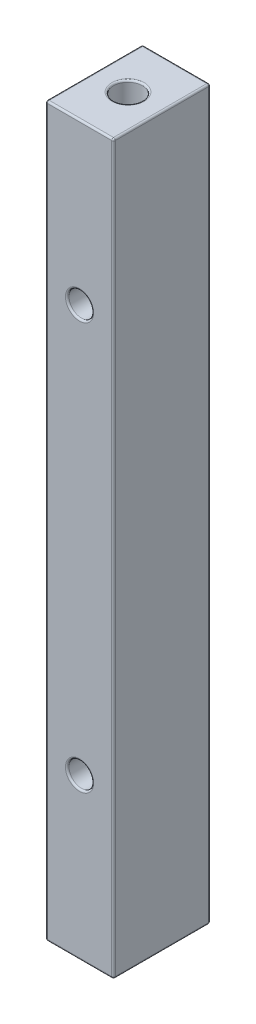
ISO-10303-21;
HEADER;
FILE_DESCRIPTION(('STEP AP214'),'2;1');
FILE_NAME('part.step','',(''),(''),'','','');
FILE_SCHEMA(('AUTOMOTIVE_DESIGN { 1 0 10303 214 1 1 1 1 }'));
ENDSEC;
DATA;
#1=APPLICATION_CONTEXT('core data for automotive mechanical design processes');
#2=APPLICATION_PROTOCOL_DEFINITION('international standard','automotive_design',2000,#1);
#3=PRODUCT_CONTEXT('',#1,'mechanical');
#4=PRODUCT('Part','Part','',(#3));
#5=PRODUCT_RELATED_PRODUCT_CATEGORY('part','',(#4));
#6=PRODUCT_DEFINITION_FORMATION('','',#4);
#7=PRODUCT_DEFINITION_CONTEXT('part definition',#1,'design');
#8=PRODUCT_DEFINITION('design','',#6,#7);
#9=PRODUCT_DEFINITION_SHAPE('','',#8);
#10=(LENGTH_UNIT() NAMED_UNIT(*) SI_UNIT(.MILLI.,.METRE.));
#11=(NAMED_UNIT(*) PLANE_ANGLE_UNIT() SI_UNIT($,.RADIAN.));
#12=(NAMED_UNIT(*) SI_UNIT($,.STERADIAN.) SOLID_ANGLE_UNIT());
#13=UNCERTAINTY_MEASURE_WITH_UNIT(LENGTH_MEASURE(1.E-05),#10,'distance_accuracy_value','');
#14=(GEOMETRIC_REPRESENTATION_CONTEXT(3) GLOBAL_UNCERTAINTY_ASSIGNED_CONTEXT((#13)) GLOBAL_UNIT_ASSIGNED_CONTEXT((#10,
#11,#12)) REPRESENTATION_CONTEXT('',''));
#15=CARTESIAN_POINT('',(0.,0.,0.));
#16=DIRECTION('',(0.,0.,1.));
#17=DIRECTION('',(1.,0.,0.));
#18=AXIS2_PLACEMENT_3D('',#15,#16,#17);
#19=CARTESIAN_POINT('',(0.,51.054,0.));
#20=DIRECTION('',(0.,-1.,0.));
#21=DIRECTION('',(0.,0.,-1.));
#22=AXIS2_PLACEMENT_3D('',#19,#20,#21);
#23=CYLINDRICAL_SURFACE('',#22,2.0193);
#24=CARTESIAN_POINT('',(0.,-50.8,0.));
#25=DIRECTION('',(0.,1.,0.));
#26=DIRECTION('',(0.,0.,1.));
#27=AXIS2_PLACEMENT_3D('',#24,#25,#26);
#28=CIRCLE('',#27,2.0193);
#29=CARTESIAN_POINT('',(0.,-50.8,2.0193));
#30=VERTEX_POINT('',#29);
#31=EDGE_CURVE('E43',#30,#30,#28,.F.);
#32=ORIENTED_EDGE('',*,*,#31,.T.);
#33=EDGE_LOOP('',(#32));
#34=FACE_BOUND('',#33,.T.);
#35=CARTESIAN_POINT('',(0.,-38.354,0.));
#36=DIRECTION('',(0.,1.,0.));
#37=DIRECTION('',(0.,0.,1.));
#38=AXIS2_PLACEMENT_3D('',#35,#36,#37);
#39=CIRCLE('',#38,2.0193);
#40=CARTESIAN_POINT('',(0.,-38.354,2.0193));
#41=VERTEX_POINT('',#40);
#42=EDGE_CURVE('E293',#41,#41,#39,.F.);
#43=ORIENTED_EDGE('',*,*,#42,.F.);
#44=EDGE_LOOP('',(#43));
#45=FACE_BOUND('',#44,.T.);
#46=ADVANCED_FACE('F34',(#34,#45),#23,.F.);
#47=CARTESIAN_POINT('',(0.,51.054,0.));
#48=DIRECTION('',(0.,1.,0.));
#49=DIRECTION('',(0.,0.,1.));
#50=AXIS2_PLACEMENT_3D('',#47,#48,#49);
#51=PLANE('',#50);
#52=DIRECTION('',(0.,0.,1.));
#53=VECTOR('',#52,1.);
#54=CARTESIAN_POINT('',(-4.5085,51.054,6.79958));
#55=LINE('',#54,#53);
#56=CARTESIAN_POINT('',(-4.5085,51.054,-6.54558));
#57=VERTEX_POINT('',#56);
#58=CARTESIAN_POINT('',(-4.5085,51.054,6.54558));
#59=VERTEX_POINT('',#58);
#60=EDGE_CURVE('E136',#57,#59,#55,.T.);
#61=ORIENTED_EDGE('',*,*,#60,.T.);
#62=DIRECTION('',(1.,0.,0.));
#63=VECTOR('',#62,1.);
#64=CARTESIAN_POINT('',(4.7625,51.054,6.54558));
#65=LINE('',#64,#63);
#66=CARTESIAN_POINT('',(4.5085,51.054,6.54558));
#67=VERTEX_POINT('',#66);
#68=EDGE_CURVE('E132',#59,#67,#65,.T.);
#69=ORIENTED_EDGE('',*,*,#68,.T.);
#70=DIRECTION('',(0.,0.,-1.));
#71=VECTOR('',#70,1.);
#72=CARTESIAN_POINT('',(4.5085,51.054,-6.79958));
#73=LINE('',#72,#71);
#74=CARTESIAN_POINT('',(4.5085,51.054,-6.54558));
#75=VERTEX_POINT('',#74);
#76=EDGE_CURVE('E123',#67,#75,#73,.T.);
#77=ORIENTED_EDGE('',*,*,#76,.T.);
#78=DIRECTION('',(-1.,0.,0.));
#79=VECTOR('',#78,1.);
#80=CARTESIAN_POINT('',(-4.7625,51.054,-6.54558));
#81=LINE('',#80,#79);
#82=EDGE_CURVE('E129',#75,#57,#81,.T.);
#83=ORIENTED_EDGE('',*,*,#82,.T.);
#84=EDGE_LOOP('',(#61,#69,#77,#83));
#85=FACE_BOUND('',#84,.T.);
#86=CARTESIAN_POINT('',(0.,51.054,0.));
#87=DIRECTION('',(0.,1.,0.));
#88=DIRECTION('',(0.,0.,1.));
#89=AXIS2_PLACEMENT_3D('',#86,#87,#88);
#90=CIRCLE('',#89,2.2733);
#91=CARTESIAN_POINT('',(0.,51.054,2.2733));
#92=VERTEX_POINT('',#91);
#93=EDGE_CURVE('E162',#92,#92,#90,.F.);
#94=ORIENTED_EDGE('',*,*,#93,.T.);
#95=EDGE_LOOP('',(#94));
#96=FACE_BOUND('',#95,.T.);
#97=ADVANCED_FACE('F126',(#85,#96),#51,.T.);
#98=CARTESIAN_POINT('',(0.,-51.054,0.));
#99=DIRECTION('',(0.,1.,0.));
#100=DIRECTION('',(0.,0.,1.));
#101=AXIS2_PLACEMENT_3D('',#98,#99,#100);
#102=PLANE('',#101);
#103=DIRECTION('',(0.,0.,-1.));
#104=VECTOR('',#103,1.);
#105=CARTESIAN_POINT('',(4.5085,-51.054,0.));
#106=LINE('',#105,#104);
#107=CARTESIAN_POINT('',(4.5085,-51.054,-6.54558));
#108=VERTEX_POINT('',#107);
#109=CARTESIAN_POINT('',(4.5085,-51.054,6.54558));
#110=VERTEX_POINT('',#109);
#111=EDGE_CURVE('E185',#108,#110,#106,.F.);
#112=ORIENTED_EDGE('',*,*,#111,.T.);
#113=DIRECTION('',(1.,0.,0.));
#114=VECTOR('',#113,1.);
#115=CARTESIAN_POINT('',(0.,-51.054,6.54558));
#116=LINE('',#115,#114);
#117=CARTESIAN_POINT('',(-4.5085,-51.054,6.54558));
#118=VERTEX_POINT('',#117);
#119=EDGE_CURVE('E190',#110,#118,#116,.F.);
#120=ORIENTED_EDGE('',*,*,#119,.T.);
#121=DIRECTION('',(0.,0.,1.));
#122=VECTOR('',#121,1.);
#123=CARTESIAN_POINT('',(-4.5085,-51.054,0.));
#124=LINE('',#123,#122);
#125=CARTESIAN_POINT('',(-4.5085,-51.054,-6.54558));
#126=VERTEX_POINT('',#125);
#127=EDGE_CURVE('E187',#118,#126,#124,.F.);
#128=ORIENTED_EDGE('',*,*,#127,.T.);
#129=DIRECTION('',(-1.,0.,0.));
#130=VECTOR('',#129,1.);
#131=CARTESIAN_POINT('',(0.,-51.054,-6.54558));
#132=LINE('',#131,#130);
#133=EDGE_CURVE('E183',#126,#108,#132,.F.);
#134=ORIENTED_EDGE('',*,*,#133,.T.);
#135=EDGE_LOOP('',(#112,#120,#128,#134));
#136=FACE_BOUND('',#135,.T.);
#137=CARTESIAN_POINT('',(0.,-51.054,0.));
#138=DIRECTION('',(0.,1.,0.));
#139=DIRECTION('',(0.,0.,1.));
#140=AXIS2_PLACEMENT_3D('',#137,#138,#139);
#141=CIRCLE('',#140,2.2733);
#142=CARTESIAN_POINT('',(0.,-51.054,2.2733));
#143=VERTEX_POINT('',#142);
#144=EDGE_CURVE('E180',#143,#143,#141,.T.);
#145=ORIENTED_EDGE('',*,*,#144,.T.);
#146=EDGE_LOOP('',(#145));
#147=FACE_BOUND('',#146,.T.);
#148=ADVANCED_FACE('F328',(#136,#147),#102,.F.);
#149=CARTESIAN_POINT('',(4.7625,51.054,6.79958));
#150=DIRECTION('',(-1.,0.,0.));
#151=DIRECTION('',(0.,0.,1.));
#152=AXIS2_PLACEMENT_3D('',#149,#150,#151);
#153=PLANE('',#152);
#154=DIRECTION('',(0.,0.,-1.));
#155=VECTOR('',#154,1.);
#156=CARTESIAN_POINT('',(4.7625,50.8,6.79958));
#157=LINE('',#156,#155);
#158=CARTESIAN_POINT('',(4.7625,50.8,-6.54558));
#159=VERTEX_POINT('',#158);
#160=CARTESIAN_POINT('',(4.7625,50.8,6.54558));
#161=VERTEX_POINT('',#160);
#162=EDGE_CURVE('E144',#159,#161,#157,.F.);
#163=ORIENTED_EDGE('',*,*,#162,.T.);
#164=DIRECTION('',(0.,-1.,0.));
#165=VECTOR('',#164,1.);
#166=CARTESIAN_POINT('',(4.7625,51.054,6.54558));
#167=LINE('',#166,#165);
#168=CARTESIAN_POINT('',(4.7625,-50.8,6.54558));
#169=VERTEX_POINT('',#168);
#170=EDGE_CURVE('E197',#161,#169,#167,.T.);
#171=ORIENTED_EDGE('',*,*,#170,.T.);
#172=DIRECTION('',(0.,0.,-1.));
#173=VECTOR('',#172,1.);
#174=CARTESIAN_POINT('',(4.7625,-50.8,6.79958));
#175=LINE('',#174,#173);
#176=CARTESIAN_POINT('',(4.7625,-50.8,-6.54558));
#177=VERTEX_POINT('',#176);
#178=EDGE_CURVE('E194',#169,#177,#175,.T.);
#179=ORIENTED_EDGE('',*,*,#178,.T.);
#180=DIRECTION('',(0.,-1.,0.));
#181=VECTOR('',#180,1.);
#182=CARTESIAN_POINT('',(4.7625,51.054,-6.54558));
#183=LINE('',#182,#181);
#184=EDGE_CURVE('E192',#177,#159,#183,.F.);
#185=ORIENTED_EDGE('',*,*,#184,.T.);
#186=EDGE_LOOP('',(#163,#171,#179,#185));
#187=FACE_BOUND('',#186,.T.);
#188=ADVANCED_FACE('F339',(#187),#153,.F.);
#189=CARTESIAN_POINT('',(4.7625,51.054,-6.79958));
#190=DIRECTION('',(0.,0.,1.));
#191=DIRECTION('',(1.,0.,0.));
#192=AXIS2_PLACEMENT_3D('',#189,#190,#191);
#193=PLANE('',#192);
#194=DIRECTION('',(-1.,0.,0.));
#195=VECTOR('',#194,1.);
#196=CARTESIAN_POINT('',(4.7625,50.8,-6.79958));
#197=LINE('',#196,#195);
#198=CARTESIAN_POINT('',(-4.5085,50.8,-6.79958));
#199=VERTEX_POINT('',#198);
#200=CARTESIAN_POINT('',(4.5085,50.8,-6.79958));
#201=VERTEX_POINT('',#200);
#202=EDGE_CURVE('E51',#199,#201,#197,.F.);
#203=ORIENTED_EDGE('',*,*,#202,.T.);
#204=DIRECTION('',(0.,-1.,0.));
#205=VECTOR('',#204,1.);
#206=CARTESIAN_POINT('',(4.5085,51.054,-6.79958));
#207=LINE('',#206,#205);
#208=CARTESIAN_POINT('',(4.5085,-50.8,-6.79958));
#209=VERTEX_POINT('',#208);
#210=EDGE_CURVE('E236',#201,#209,#207,.T.);
#211=ORIENTED_EDGE('',*,*,#210,.T.);
#212=DIRECTION('',(-1.,0.,0.));
#213=VECTOR('',#212,1.);
#214=CARTESIAN_POINT('',(4.7625,-50.8,-6.79958));
#215=LINE('',#214,#213);
#216=CARTESIAN_POINT('',(-4.5085,-50.8,-6.79958));
#217=VERTEX_POINT('',#216);
#218=EDGE_CURVE('E232',#209,#217,#215,.T.);
#219=ORIENTED_EDGE('',*,*,#218,.T.);
#220=DIRECTION('',(0.,-1.,0.));
#221=VECTOR('',#220,1.);
#222=CARTESIAN_POINT('',(-4.5085,51.054,-6.79958));
#223=LINE('',#222,#221);
#224=EDGE_CURVE('E56',#217,#199,#223,.F.);
#225=ORIENTED_EDGE('',*,*,#224,.T.);
#226=EDGE_LOOP('',(#203,#211,#219,#225));
#227=FACE_BOUND('',#226,.T.);
#228=CARTESIAN_POINT('',(0.,-28.575,-6.79958));
#229=DIRECTION('',(0.,0.,1.));
#230=DIRECTION('',(1.,0.,0.));
#231=AXIS2_PLACEMENT_3D('',#228,#229,#230);
#232=CIRCLE('',#231,1.9812);
#233=CARTESIAN_POINT('',(1.9812,-28.575,-6.79958));
#234=VERTEX_POINT('',#233);
#235=EDGE_CURVE('E229',#234,#234,#232,.T.);
#236=ORIENTED_EDGE('',*,*,#235,.T.);
#237=EDGE_LOOP('',(#236));
#238=FACE_BOUND('',#237,.T.);
#239=CARTESIAN_POINT('',(0.,28.575,-6.79958));
#240=DIRECTION('',(0.,0.,1.));
#241=DIRECTION('',(1.,0.,0.));
#242=AXIS2_PLACEMENT_3D('',#239,#240,#241);
#243=CIRCLE('',#242,1.9812);
#244=CARTESIAN_POINT('',(1.98120000000001,28.575,-6.79958));
#245=VERTEX_POINT('',#244);
#246=EDGE_CURVE('E226',#245,#245,#243,.T.);
#247=ORIENTED_EDGE('',*,*,#246,.T.);
#248=EDGE_LOOP('',(#247));
#249=FACE_BOUND('',#248,.T.);
#250=ADVANCED_FACE('F345',(#227,#238,#249),#193,.F.);
#251=CARTESIAN_POINT('',(-4.7625,51.054,6.79958));
#252=DIRECTION('',(1.,0.,0.));
#253=DIRECTION('',(0.,0.,-1.));
#254=AXIS2_PLACEMENT_3D('',#251,#252,#253);
#255=PLANE('',#254);
#256=DIRECTION('',(0.,0.,1.));
#257=VECTOR('',#256,1.);
#258=CARTESIAN_POINT('',(-4.7625,-50.8,6.79958));
#259=LINE('',#258,#257);
#260=CARTESIAN_POINT('',(-4.7625,-50.8,-6.54558));
#261=VERTEX_POINT('',#260);
#262=CARTESIAN_POINT('',(-4.7625,-50.8,6.54558));
#263=VERTEX_POINT('',#262);
#264=EDGE_CURVE('E173',#261,#263,#259,.T.);
#265=ORIENTED_EDGE('',*,*,#264,.T.);
#266=DIRECTION('',(0.,-1.,0.));
#267=VECTOR('',#266,1.);
#268=CARTESIAN_POINT('',(-4.7625,51.054,6.54558));
#269=LINE('',#268,#267);
#270=CARTESIAN_POINT('',(-4.7625,50.8,6.54558));
#271=VERTEX_POINT('',#270);
#272=EDGE_CURVE('E178',#263,#271,#269,.F.);
#273=ORIENTED_EDGE('',*,*,#272,.T.);
#274=DIRECTION('',(0.,0.,1.));
#275=VECTOR('',#274,1.);
#276=CARTESIAN_POINT('',(-4.7625,50.8,-6.79958));
#277=LINE('',#276,#275);
#278=CARTESIAN_POINT('',(-4.7625,50.8,-6.54558));
#279=VERTEX_POINT('',#278);
#280=EDGE_CURVE('E175',#271,#279,#277,.F.);
#281=ORIENTED_EDGE('',*,*,#280,.T.);
#282=DIRECTION('',(0.,-1.,0.));
#283=VECTOR('',#282,1.);
#284=CARTESIAN_POINT('',(-4.7625,51.054,-6.54558));
#285=LINE('',#284,#283);
#286=EDGE_CURVE('E171',#279,#261,#285,.T.);
#287=ORIENTED_EDGE('',*,*,#286,.T.);
#288=EDGE_LOOP('',(#265,#273,#281,#287));
#289=FACE_BOUND('',#288,.T.);
#290=ADVANCED_FACE('F318',(#289),#255,.F.);
#291=CARTESIAN_POINT('',(4.7625,51.054,6.79958));
#292=DIRECTION('',(0.,0.,-1.));
#293=DIRECTION('',(-1.,0.,0.));
#294=AXIS2_PLACEMENT_3D('',#291,#292,#293);
#295=PLANE('',#294);
#296=DIRECTION('',(1.,0.,0.));
#297=VECTOR('',#296,1.);
#298=CARTESIAN_POINT('',(-4.7625,50.8,6.79958));
#299=LINE('',#298,#297);
#300=CARTESIAN_POINT('',(4.5085,50.8,6.79958));
#301=VERTEX_POINT('',#300);
#302=CARTESIAN_POINT('',(-4.5085,50.8,6.79958));
#303=VERTEX_POINT('',#302);
#304=EDGE_CURVE('E209',#301,#303,#299,.F.);
#305=ORIENTED_EDGE('',*,*,#304,.T.);
#306=DIRECTION('',(0.,-1.,0.));
#307=VECTOR('',#306,1.);
#308=CARTESIAN_POINT('',(-4.5085,51.054,6.79958));
#309=LINE('',#308,#307);
#310=CARTESIAN_POINT('',(-4.5085,-50.8,6.79958));
#311=VERTEX_POINT('',#310);
#312=EDGE_CURVE('E211',#303,#311,#309,.T.);
#313=ORIENTED_EDGE('',*,*,#312,.T.);
#314=DIRECTION('',(1.,0.,0.));
#315=VECTOR('',#314,1.);
#316=CARTESIAN_POINT('',(4.7625,-50.8,6.79958));
#317=LINE('',#316,#315);
#318=CARTESIAN_POINT('',(4.5085,-50.8,6.79958));
#319=VERTEX_POINT('',#318);
#320=EDGE_CURVE('E205',#311,#319,#317,.T.);
#321=ORIENTED_EDGE('',*,*,#320,.T.);
#322=DIRECTION('',(0.,-1.,0.));
#323=VECTOR('',#322,1.);
#324=CARTESIAN_POINT('',(4.5085,51.054,6.79958));
#325=LINE('',#324,#323);
#326=EDGE_CURVE('E207',#319,#301,#325,.F.);
#327=ORIENTED_EDGE('',*,*,#326,.T.);
#328=EDGE_LOOP('',(#305,#313,#321,#327));
#329=FACE_BOUND('',#328,.T.);
#330=CARTESIAN_POINT('',(0.,-28.575,6.79958));
#331=DIRECTION('',(0.,0.,-1.));
#332=DIRECTION('',(-1.,0.,0.));
#333=AXIS2_PLACEMENT_3D('',#330,#331,#332);
#334=CIRCLE('',#333,1.9812);
#335=CARTESIAN_POINT('',(-1.9812,-28.575,6.79958));
#336=VERTEX_POINT('',#335);
#337=EDGE_CURVE('E202',#336,#336,#334,.T.);
#338=ORIENTED_EDGE('',*,*,#337,.T.);
#339=EDGE_LOOP('',(#338));
#340=FACE_BOUND('',#339,.T.);
#341=CARTESIAN_POINT('',(0.,28.575,6.79958));
#342=DIRECTION('',(0.,0.,-1.));
#343=DIRECTION('',(-1.,0.,0.));
#344=AXIS2_PLACEMENT_3D('',#341,#342,#343);
#345=CIRCLE('',#344,1.9812);
#346=CARTESIAN_POINT('',(-1.98119999999999,28.575,6.79958));
#347=VERTEX_POINT('',#346);
#348=EDGE_CURVE('E199',#347,#347,#345,.T.);
#349=ORIENTED_EDGE('',*,*,#348,.T.);
#350=EDGE_LOOP('',(#349));
#351=FACE_BOUND('',#350,.T.);
#352=ADVANCED_FACE('F310',(#329,#340,#351),#295,.F.);
#353=CARTESIAN_POINT('',(0.,50.8,0.));
#354=DIRECTION('',(0.,1.,0.));
#355=DIRECTION('',(0.,0.,1.));
#356=AXIS2_PLACEMENT_3D('',#353,#354,#355);
#357=CIRCLE('',#356,2.0193);
#358=CARTESIAN_POINT('',(0.,50.8,2.0193));
#359=VERTEX_POINT('',#358);
#360=EDGE_CURVE('E12',#359,#359,#357,.T.);
#361=ORIENTED_EDGE('',*,*,#360,.T.);
#362=EDGE_LOOP('',(#361));
#363=FACE_BOUND('',#362,.T.);
#364=CARTESIAN_POINT('',(0.,38.354,0.));
#365=DIRECTION('',(0.,1.,0.));
#366=DIRECTION('',(0.,0.,1.));
#367=AXIS2_PLACEMENT_3D('',#364,#365,#366);
#368=CIRCLE('',#367,2.0193);
#369=CARTESIAN_POINT('',(0.,38.354,2.0193));
#370=VERTEX_POINT('',#369);
#371=EDGE_CURVE('E165',#370,#370,#368,.T.);
#372=ORIENTED_EDGE('',*,*,#371,.F.);
#373=EDGE_LOOP('',(#372));
#374=FACE_BOUND('',#373,.T.);
#375=ADVANCED_FACE('F307',(#363,#374),#23,.F.);
#376=CARTESIAN_POINT('',(0.,-38.354,0.));
#377=DIRECTION('',(0.,1.,0.));
#378=DIRECTION('',(0.,0.,1.));
#379=AXIS2_PLACEMENT_3D('',#376,#377,#378);
#380=PLANE('',#379);
#381=ORIENTED_EDGE('',*,*,#42,.T.);
#382=EDGE_LOOP('',(#381));
#383=FACE_BOUND('',#382,.T.);
#384=ADVANCED_FACE('F309',(#383),#380,.F.);
#385=CARTESIAN_POINT('',(0.,38.354,0.));
#386=DIRECTION('',(0.,1.,0.));
#387=DIRECTION('',(0.,0.,1.));
#388=AXIS2_PLACEMENT_3D('',#385,#386,#387);
#389=PLANE('',#388);
#390=ORIENTED_EDGE('',*,*,#371,.T.);
#391=EDGE_LOOP('',(#390));
#392=FACE_BOUND('',#391,.T.);
#393=ADVANCED_FACE('F305',(#392),#389,.T.);
#394=CARTESIAN_POINT('',(0.,-28.575,11.6848393298616));
#395=DIRECTION('',(0.,0.,-1.));
#396=DIRECTION('',(-1.,0.,0.));
#397=AXIS2_PLACEMENT_3D('',#394,#395,#396);
#398=CYLINDRICAL_SURFACE('',#397,1.7272);
#399=CARTESIAN_POINT('',(0.,-28.575,6.54558));
#400=DIRECTION('',(0.,0.,-1.));
#401=DIRECTION('',(-1.,0.,0.));
#402=AXIS2_PLACEMENT_3D('',#399,#400,#401);
#403=CIRCLE('',#402,1.7272);
#404=CARTESIAN_POINT('',(-1.7272,-28.575,6.54558));
#405=VERTEX_POINT('',#404);
#406=EDGE_CURVE('E217',#405,#405,#403,.F.);
#407=ORIENTED_EDGE('',*,*,#406,.T.);
#408=EDGE_LOOP('',(#407));
#409=FACE_BOUND('',#408,.T.);
#410=CARTESIAN_POINT('',(0.,-28.575,-6.54558));
#411=DIRECTION('',(0.,0.,1.));
#412=DIRECTION('',(1.,0.,0.));
#413=AXIS2_PLACEMENT_3D('',#410,#411,#412);
#414=CIRCLE('',#413,1.7272);
#415=CARTESIAN_POINT('',(1.7272,-28.575,-6.54558));
#416=VERTEX_POINT('',#415);
#417=EDGE_CURVE('E214',#416,#416,#414,.F.);
#418=ORIENTED_EDGE('',*,*,#417,.T.);
#419=EDGE_LOOP('',(#418));
#420=FACE_BOUND('',#419,.T.);
#421=ADVANCED_FACE('F448',(#409,#420),#398,.F.);
#422=CARTESIAN_POINT('',(0.,28.575,11.6848393298616));
#423=DIRECTION('',(0.,0.,-1.));
#424=DIRECTION('',(-1.,0.,0.));
#425=AXIS2_PLACEMENT_3D('',#422,#423,#424);
#426=CYLINDRICAL_SURFACE('',#425,1.7272);
#427=CARTESIAN_POINT('',(0.,28.575,6.54558));
#428=DIRECTION('',(0.,0.,-1.));
#429=DIRECTION('',(-1.,0.,0.));
#430=AXIS2_PLACEMENT_3D('',#427,#428,#429);
#431=CIRCLE('',#430,1.7272);
#432=CARTESIAN_POINT('',(-1.72719999999999,28.575,6.54558));
#433=VERTEX_POINT('',#432);
#434=EDGE_CURVE('E223',#433,#433,#431,.F.);
#435=ORIENTED_EDGE('',*,*,#434,.T.);
#436=EDGE_LOOP('',(#435));
#437=FACE_BOUND('',#436,.T.);
#438=CARTESIAN_POINT('',(0.,28.575,-6.54558));
#439=DIRECTION('',(0.,0.,1.));
#440=DIRECTION('',(1.,0.,0.));
#441=AXIS2_PLACEMENT_3D('',#438,#439,#440);
#442=CIRCLE('',#441,1.7272);
#443=CARTESIAN_POINT('',(1.72720000000001,28.575,-6.54558));
#444=VERTEX_POINT('',#443);
#445=EDGE_CURVE('E220',#444,#444,#442,.F.);
#446=ORIENTED_EDGE('',*,*,#445,.T.);
#447=EDGE_LOOP('',(#446));
#448=FACE_BOUND('',#447,.T.);
#449=ADVANCED_FACE('F426',(#437,#448),#426,.F.);
#450=CARTESIAN_POINT('',(4.5085,-50.8,6.79958));
#451=DIRECTION('',(0.,0.,-1.));
#452=DIRECTION('',(-1.,0.,0.));
#453=AXIS2_PLACEMENT_3D('',#450,#451,#452);
#454=CYLINDRICAL_SURFACE('',#453,0.254);
#455=CARTESIAN_POINT('',(4.5085,-50.8,-6.54558));
#456=DIRECTION('',(0.,0.,-1.));
#457=DIRECTION('',(-1.,0.,0.));
#458=AXIS2_PLACEMENT_3D('',#455,#456,#457);
#459=CIRCLE('',#458,0.254);
#460=EDGE_CURVE('E38',#177,#108,#459,.T.);
#461=ORIENTED_EDGE('',*,*,#460,.F.);
#462=ORIENTED_EDGE('',*,*,#178,.F.);
#463=CARTESIAN_POINT('',(4.5085,-50.8,6.54558));
#464=DIRECTION('',(0.,0.,1.));
#465=DIRECTION('',(1.,0.,0.));
#466=AXIS2_PLACEMENT_3D('',#463,#464,#465);
#467=CIRCLE('',#466,0.254);
#468=EDGE_CURVE('E286',#110,#169,#467,.T.);
#469=ORIENTED_EDGE('',*,*,#468,.F.);
#470=ORIENTED_EDGE('',*,*,#111,.F.);
#471=EDGE_LOOP('',(#461,#462,#469,#470));
#472=FACE_BOUND('',#471,.T.);
#473=ADVANCED_FACE('F423',(#472),#454,.T.);
#474=CARTESIAN_POINT('',(4.5085,-50.8,-6.54558));
#475=DIRECTION('',(0.,0.,1.));
#476=DIRECTION('',(1.,0.,0.));
#477=AXIS2_PLACEMENT_3D('',#474,#475,#476);
#478=SPHERICAL_SURFACE('',#477,0.254);
#479=CARTESIAN_POINT('',(4.5085,-50.8,-6.54558));
#480=DIRECTION('',(0.,-1.,0.));
#481=DIRECTION('',(0.,0.,-1.));
#482=AXIS2_PLACEMENT_3D('',#479,#480,#481);
#483=CIRCLE('',#482,0.254);
#484=EDGE_CURVE('E281',#177,#209,#483,.F.);
#485=ORIENTED_EDGE('',*,*,#484,.F.);
#486=ORIENTED_EDGE('',*,*,#460,.T.);
#487=CARTESIAN_POINT('',(4.5085,-50.8,-6.54558));
#488=DIRECTION('',(1.,0.,0.));
#489=DIRECTION('',(0.,0.,-1.));
#490=AXIS2_PLACEMENT_3D('',#487,#488,#489);
#491=CIRCLE('',#490,0.254);
#492=EDGE_CURVE('E284',#209,#108,#491,.F.);
#493=ORIENTED_EDGE('',*,*,#492,.F.);
#494=EDGE_LOOP('',(#485,#486,#493));
#495=FACE_BOUND('',#494,.T.);
#496=ADVANCED_FACE('F420',(#495),#478,.T.);
#497=CARTESIAN_POINT('',(4.5085,-50.8,6.54558));
#498=DIRECTION('',(0.,0.,1.));
#499=DIRECTION('',(1.,0.,0.));
#500=AXIS2_PLACEMENT_3D('',#497,#498,#499);
#501=SPHERICAL_SURFACE('',#500,0.254);
#502=CARTESIAN_POINT('',(4.5085,-50.8,6.54558));
#503=DIRECTION('',(1.,0.,0.));
#504=DIRECTION('',(0.,0.,-1.));
#505=AXIS2_PLACEMENT_3D('',#502,#503,#504);
#506=CIRCLE('',#505,0.254);
#507=EDGE_CURVE('E275',#110,#319,#506,.F.);
#508=ORIENTED_EDGE('',*,*,#507,.F.);
#509=ORIENTED_EDGE('',*,*,#468,.T.);
#510=CARTESIAN_POINT('',(4.5085,-50.8,6.54558));
#511=DIRECTION('',(0.,-1.,0.));
#512=DIRECTION('',(0.,0.,-1.));
#513=AXIS2_PLACEMENT_3D('',#510,#511,#512);
#514=CIRCLE('',#513,0.254);
#515=EDGE_CURVE('E278',#319,#169,#514,.F.);
#516=ORIENTED_EDGE('',*,*,#515,.F.);
#517=EDGE_LOOP('',(#508,#509,#516));
#518=FACE_BOUND('',#517,.T.);
#519=ADVANCED_FACE('F416',(#518),#501,.T.);
#520=CARTESIAN_POINT('',(4.7625,-50.8,-6.54558));
#521=DIRECTION('',(-1.,0.,0.));
#522=DIRECTION('',(0.,0.,1.));
#523=AXIS2_PLACEMENT_3D('',#520,#521,#522);
#524=CYLINDRICAL_SURFACE('',#523,0.254);
#525=ORIENTED_EDGE('',*,*,#492,.T.);
#526=ORIENTED_EDGE('',*,*,#133,.F.);
#527=CARTESIAN_POINT('',(-4.5085,-50.8,-6.54558));
#528=DIRECTION('',(-1.,0.,0.));
#529=DIRECTION('',(0.,0.,1.));
#530=AXIS2_PLACEMENT_3D('',#527,#528,#529);
#531=CIRCLE('',#530,0.254);
#532=EDGE_CURVE('E270',#217,#126,#531,.T.);
#533=ORIENTED_EDGE('',*,*,#532,.F.);
#534=ORIENTED_EDGE('',*,*,#218,.F.);
#535=EDGE_LOOP('',(#525,#526,#533,#534));
#536=FACE_BOUND('',#535,.T.);
#537=ADVANCED_FACE('F412',(#536),#524,.T.);
#538=CARTESIAN_POINT('',(4.5085,51.054,-6.54558));
#539=DIRECTION('',(0.,-1.,0.));
#540=DIRECTION('',(0.,0.,-1.));
#541=AXIS2_PLACEMENT_3D('',#538,#539,#540);
#542=CYLINDRICAL_SURFACE('',#541,0.254);
#543=ORIENTED_EDGE('',*,*,#484,.T.);
#544=ORIENTED_EDGE('',*,*,#210,.F.);
#545=CARTESIAN_POINT('',(4.5085,50.8,-6.54558));
#546=DIRECTION('',(0.,1.,0.));
#547=DIRECTION('',(0.,0.,1.));
#548=AXIS2_PLACEMENT_3D('',#545,#546,#547);
#549=CIRCLE('',#548,0.254);
#550=EDGE_CURVE('E148',#159,#201,#549,.T.);
#551=ORIENTED_EDGE('',*,*,#550,.F.);
#552=ORIENTED_EDGE('',*,*,#184,.F.);
#553=EDGE_LOOP('',(#543,#544,#551,#552));
#554=FACE_BOUND('',#553,.T.);
#555=ADVANCED_FACE('F409',(#554),#542,.T.);
#556=CARTESIAN_POINT('',(4.5085,50.8,0.));
#557=DIRECTION('',(0.,0.,1.));
#558=DIRECTION('',(1.,0.,0.));
#559=AXIS2_PLACEMENT_3D('',#556,#557,#558);
#560=CYLINDRICAL_SURFACE('',#559,0.254);
#561=CARTESIAN_POINT('',(4.5085,50.8,6.54558));
#562=DIRECTION('',(0.,0.,1.));
#563=DIRECTION('',(1.,0.,0.));
#564=AXIS2_PLACEMENT_3D('',#561,#562,#563);
#565=CIRCLE('',#564,0.254);
#566=EDGE_CURVE('E149',#161,#67,#565,.T.);
#567=ORIENTED_EDGE('',*,*,#566,.F.);
#568=ORIENTED_EDGE('',*,*,#162,.F.);
#569=CARTESIAN_POINT('',(4.5085,50.8,-6.54558));
#570=DIRECTION('',(0.,0.,-1.));
#571=DIRECTION('',(-1.,0.,0.));
#572=AXIS2_PLACEMENT_3D('',#569,#570,#571);
#573=CIRCLE('',#572,0.254);
#574=EDGE_CURVE('E140',#75,#159,#573,.T.);
#575=ORIENTED_EDGE('',*,*,#574,.F.);
#576=ORIENTED_EDGE('',*,*,#76,.F.);
#577=EDGE_LOOP('',(#567,#568,#575,#576));
#578=FACE_BOUND('',#577,.T.);
#579=ADVANCED_FACE('F142',(#578),#560,.T.);
#580=CARTESIAN_POINT('',(4.5085,51.054,6.54558));
#581=DIRECTION('',(0.,-1.,0.));
#582=DIRECTION('',(0.,0.,-1.));
#583=AXIS2_PLACEMENT_3D('',#580,#581,#582);
#584=CYLINDRICAL_SURFACE('',#583,0.254);
#585=ORIENTED_EDGE('',*,*,#515,.T.);
#586=ORIENTED_EDGE('',*,*,#170,.F.);
#587=CARTESIAN_POINT('',(4.5085,50.8,6.54558));
#588=DIRECTION('',(0.,1.,0.));
#589=DIRECTION('',(0.,0.,1.));
#590=AXIS2_PLACEMENT_3D('',#587,#588,#589);
#591=CIRCLE('',#590,0.254);
#592=EDGE_CURVE('E266',#301,#161,#591,.T.);
#593=ORIENTED_EDGE('',*,*,#592,.F.);
#594=ORIENTED_EDGE('',*,*,#326,.F.);
#595=EDGE_LOOP('',(#585,#586,#593,#594));
#596=FACE_BOUND('',#595,.T.);
#597=ADVANCED_FACE('F402',(#596),#584,.T.);
#598=CARTESIAN_POINT('',(4.7625,-50.8,6.54558));
#599=DIRECTION('',(1.,0.,0.));
#600=DIRECTION('',(0.,0.,-1.));
#601=AXIS2_PLACEMENT_3D('',#598,#599,#600);
#602=CYLINDRICAL_SURFACE('',#601,0.254);
#603=ORIENTED_EDGE('',*,*,#507,.T.);
#604=ORIENTED_EDGE('',*,*,#320,.F.);
#605=CARTESIAN_POINT('',(-4.5085,-50.8,6.54558));
#606=DIRECTION('',(-1.,0.,0.));
#607=DIRECTION('',(0.,0.,1.));
#608=AXIS2_PLACEMENT_3D('',#605,#606,#607);
#609=CIRCLE('',#608,0.254);
#610=EDGE_CURVE('E263',#118,#311,#609,.T.);
#611=ORIENTED_EDGE('',*,*,#610,.F.);
#612=ORIENTED_EDGE('',*,*,#119,.F.);
#613=EDGE_LOOP('',(#603,#604,#611,#612));
#614=FACE_BOUND('',#613,.T.);
#615=ADVANCED_FACE('F398',(#614),#602,.T.);
#616=CARTESIAN_POINT('',(-4.5085,-50.8,6.79958));
#617=DIRECTION('',(0.,0.,1.));
#618=DIRECTION('',(1.,0.,0.));
#619=AXIS2_PLACEMENT_3D('',#616,#617,#618);
#620=CYLINDRICAL_SURFACE('',#619,0.254);
#621=CARTESIAN_POINT('',(-4.5085,-50.8,-6.54558));
#622=DIRECTION('',(0.,0.,-1.));
#623=DIRECTION('',(-1.,0.,0.));
#624=AXIS2_PLACEMENT_3D('',#621,#622,#623);
#625=CIRCLE('',#624,0.254);
#626=EDGE_CURVE('E272',#126,#261,#625,.T.);
#627=ORIENTED_EDGE('',*,*,#626,.F.);
#628=ORIENTED_EDGE('',*,*,#127,.F.);
#629=CARTESIAN_POINT('',(-4.5085,-50.8,6.54558));
#630=DIRECTION('',(0.,0.,1.));
#631=DIRECTION('',(1.,0.,0.));
#632=AXIS2_PLACEMENT_3D('',#629,#630,#631);
#633=CIRCLE('',#632,0.254);
#634=EDGE_CURVE('E260',#263,#118,#633,.T.);
#635=ORIENTED_EDGE('',*,*,#634,.F.);
#636=ORIENTED_EDGE('',*,*,#264,.F.);
#637=EDGE_LOOP('',(#627,#628,#635,#636));
#638=FACE_BOUND('',#637,.T.);
#639=ADVANCED_FACE('F394',(#638),#620,.T.);
#640=CARTESIAN_POINT('',(-4.5085,-50.8,-6.54558));
#641=DIRECTION('',(0.,0.,1.));
#642=DIRECTION('',(1.,0.,0.));
#643=AXIS2_PLACEMENT_3D('',#640,#641,#642);
#644=SPHERICAL_SURFACE('',#643,0.254);
#645=ORIENTED_EDGE('',*,*,#532,.T.);
#646=ORIENTED_EDGE('',*,*,#626,.T.);
#647=CARTESIAN_POINT('',(-4.5085,-50.8,-6.54558));
#648=DIRECTION('',(0.,-1.,0.));
#649=DIRECTION('',(0.,0.,-1.));
#650=AXIS2_PLACEMENT_3D('',#647,#648,#649);
#651=CIRCLE('',#650,0.254);
#652=EDGE_CURVE('E155',#217,#261,#651,.F.);
#653=ORIENTED_EDGE('',*,*,#652,.F.);
#654=EDGE_LOOP('',(#645,#646,#653));
#655=FACE_BOUND('',#654,.T.);
#656=ADVANCED_FACE('F391',(#655),#644,.T.);
#657=CARTESIAN_POINT('',(4.5085,50.8,-6.54558));
#658=DIRECTION('',(0.,0.,1.));
#659=DIRECTION('',(1.,0.,0.));
#660=AXIS2_PLACEMENT_3D('',#657,#658,#659);
#661=SPHERICAL_SURFACE('',#660,0.254);
#662=ORIENTED_EDGE('',*,*,#574,.T.);
#663=ORIENTED_EDGE('',*,*,#550,.T.);
#664=CARTESIAN_POINT('',(4.5085,50.8,-6.54558));
#665=DIRECTION('',(1.,0.,0.));
#666=DIRECTION('',(0.,0.,-1.));
#667=AXIS2_PLACEMENT_3D('',#664,#665,#666);
#668=CIRCLE('',#667,0.254);
#669=EDGE_CURVE('E152',#75,#201,#668,.F.);
#670=ORIENTED_EDGE('',*,*,#669,.F.);
#671=EDGE_LOOP('',(#662,#663,#670));
#672=FACE_BOUND('',#671,.T.);
#673=ADVANCED_FACE('F153',(#672),#661,.T.);
#674=CARTESIAN_POINT('',(4.5085,50.8,6.54558));
#675=DIRECTION('',(0.,0.,1.));
#676=DIRECTION('',(1.,0.,0.));
#677=AXIS2_PLACEMENT_3D('',#674,#675,#676);
#678=SPHERICAL_SURFACE('',#677,0.254);
#679=ORIENTED_EDGE('',*,*,#592,.T.);
#680=ORIENTED_EDGE('',*,*,#566,.T.);
#681=CARTESIAN_POINT('',(4.5085,50.8,6.54558));
#682=DIRECTION('',(1.,0.,0.));
#683=DIRECTION('',(0.,0.,-1.));
#684=AXIS2_PLACEMENT_3D('',#681,#682,#683);
#685=CIRCLE('',#684,0.254);
#686=EDGE_CURVE('E156',#301,#67,#685,.F.);
#687=ORIENTED_EDGE('',*,*,#686,.F.);
#688=EDGE_LOOP('',(#679,#680,#687));
#689=FACE_BOUND('',#688,.T.);
#690=ADVANCED_FACE('F384',(#689),#678,.T.);
#691=CARTESIAN_POINT('',(-4.5085,-50.8,6.54558));
#692=DIRECTION('',(0.,0.,1.));
#693=DIRECTION('',(1.,0.,0.));
#694=AXIS2_PLACEMENT_3D('',#691,#692,#693);
#695=SPHERICAL_SURFACE('',#694,0.254);
#696=ORIENTED_EDGE('',*,*,#634,.T.);
#697=ORIENTED_EDGE('',*,*,#610,.T.);
#698=CARTESIAN_POINT('',(-4.5085,-50.8,6.54558));
#699=DIRECTION('',(0.,-1.,0.));
#700=DIRECTION('',(0.,0.,-1.));
#701=AXIS2_PLACEMENT_3D('',#698,#699,#700);
#702=CIRCLE('',#701,0.254);
#703=EDGE_CURVE('E254',#263,#311,#702,.F.);
#704=ORIENTED_EDGE('',*,*,#703,.F.);
#705=EDGE_LOOP('',(#696,#697,#704));
#706=FACE_BOUND('',#705,.T.);
#707=ADVANCED_FACE('F380',(#706),#695,.T.);
#708=CARTESIAN_POINT('',(-4.5085,51.054,-6.54558));
#709=DIRECTION('',(0.,-1.,0.));
#710=DIRECTION('',(0.,0.,-1.));
#711=AXIS2_PLACEMENT_3D('',#708,#709,#710);
#712=CYLINDRICAL_SURFACE('',#711,0.254);
#713=ORIENTED_EDGE('',*,*,#652,.T.);
#714=ORIENTED_EDGE('',*,*,#286,.F.);
#715=CARTESIAN_POINT('',(-4.5085,50.8,-6.54558));
#716=DIRECTION('',(0.,1.,0.));
#717=DIRECTION('',(0.,0.,1.));
#718=AXIS2_PLACEMENT_3D('',#715,#716,#717);
#719=CIRCLE('',#718,0.254);
#720=EDGE_CURVE('E251',#199,#279,#719,.T.);
#721=ORIENTED_EDGE('',*,*,#720,.F.);
#722=ORIENTED_EDGE('',*,*,#224,.F.);
#723=EDGE_LOOP('',(#713,#714,#721,#722));
#724=FACE_BOUND('',#723,.T.);
#725=ADVANCED_FACE('F377',(#724),#712,.T.);
#726=CARTESIAN_POINT('',(0.,50.8,-6.54558));
#727=DIRECTION('',(1.,0.,0.));
#728=DIRECTION('',(0.,0.,-1.));
#729=AXIS2_PLACEMENT_3D('',#726,#727,#728);
#730=CYLINDRICAL_SURFACE('',#729,0.254);
#731=ORIENTED_EDGE('',*,*,#669,.T.);
#732=ORIENTED_EDGE('',*,*,#202,.F.);
#733=CARTESIAN_POINT('',(-4.5085,50.8,-6.54558));
#734=DIRECTION('',(-1.,0.,0.));
#735=DIRECTION('',(0.,0.,1.));
#736=AXIS2_PLACEMENT_3D('',#733,#734,#735);
#737=CIRCLE('',#736,0.254);
#738=EDGE_CURVE('E160',#57,#199,#737,.T.);
#739=ORIENTED_EDGE('',*,*,#738,.F.);
#740=ORIENTED_EDGE('',*,*,#82,.F.);
#741=EDGE_LOOP('',(#731,#732,#739,#740));
#742=FACE_BOUND('',#741,.T.);
#743=ADVANCED_FACE('F158',(#742),#730,.T.);
#744=CARTESIAN_POINT('',(0.,50.8,6.54558));
#745=DIRECTION('',(-1.,0.,0.));
#746=DIRECTION('',(0.,0.,1.));
#747=AXIS2_PLACEMENT_3D('',#744,#745,#746);
#748=CYLINDRICAL_SURFACE('',#747,0.254);
#749=ORIENTED_EDGE('',*,*,#686,.T.);
#750=ORIENTED_EDGE('',*,*,#68,.F.);
#751=CARTESIAN_POINT('',(-4.5085,50.8,6.54558));
#752=DIRECTION('',(-1.,0.,0.));
#753=DIRECTION('',(0.,-1.,0.));
#754=AXIS2_PLACEMENT_3D('',#751,#752,#753);
#755=CIRCLE('',#754,0.254);
#756=EDGE_CURVE('E247',#303,#59,#755,.T.);
#757=ORIENTED_EDGE('',*,*,#756,.F.);
#758=ORIENTED_EDGE('',*,*,#304,.F.);
#759=EDGE_LOOP('',(#749,#750,#757,#758));
#760=FACE_BOUND('',#759,.T.);
#761=ADVANCED_FACE('F370',(#760),#748,.T.);
#762=CARTESIAN_POINT('',(-4.5085,51.054,6.54558));
#763=DIRECTION('',(0.,-1.,0.));
#764=DIRECTION('',(0.,0.,-1.));
#765=AXIS2_PLACEMENT_3D('',#762,#763,#764);
#766=CYLINDRICAL_SURFACE('',#765,0.254);
#767=ORIENTED_EDGE('',*,*,#703,.T.);
#768=ORIENTED_EDGE('',*,*,#312,.F.);
#769=CARTESIAN_POINT('',(-4.5085,50.8,6.54558));
#770=DIRECTION('',(0.,1.,0.));
#771=DIRECTION('',(0.,0.,1.));
#772=AXIS2_PLACEMENT_3D('',#769,#770,#771);
#773=CIRCLE('',#772,0.254);
#774=EDGE_CURVE('E244',#271,#303,#773,.T.);
#775=ORIENTED_EDGE('',*,*,#774,.F.);
#776=ORIENTED_EDGE('',*,*,#272,.F.);
#777=EDGE_LOOP('',(#767,#768,#775,#776));
#778=FACE_BOUND('',#777,.T.);
#779=ADVANCED_FACE('F366',(#778),#766,.T.);
#780=CARTESIAN_POINT('',(-4.5085,50.8,-6.54558));
#781=DIRECTION('',(0.,0.,1.));
#782=DIRECTION('',(1.,0.,0.));
#783=AXIS2_PLACEMENT_3D('',#780,#781,#782);
#784=SPHERICAL_SURFACE('',#783,0.254);
#785=ORIENTED_EDGE('',*,*,#738,.T.);
#786=ORIENTED_EDGE('',*,*,#720,.T.);
#787=CARTESIAN_POINT('',(-4.5085,50.8,-6.54558));
#788=DIRECTION('',(0.,0.,-1.));
#789=DIRECTION('',(0.,1.,0.));
#790=AXIS2_PLACEMENT_3D('',#787,#788,#789);
#791=CIRCLE('',#790,0.254);
#792=EDGE_CURVE('E242',#57,#279,#791,.F.);
#793=ORIENTED_EDGE('',*,*,#792,.F.);
#794=EDGE_LOOP('',(#785,#786,#793));
#795=FACE_BOUND('',#794,.T.);
#796=ADVANCED_FACE('F362',(#795),#784,.T.);
#797=CARTESIAN_POINT('',(-4.5085,50.8,6.54558));
#798=DIRECTION('',(0.,0.,1.));
#799=DIRECTION('',(1.,0.,0.));
#800=AXIS2_PLACEMENT_3D('',#797,#798,#799);
#801=SPHERICAL_SURFACE('',#800,0.254);
#802=ORIENTED_EDGE('',*,*,#774,.T.);
#803=ORIENTED_EDGE('',*,*,#756,.T.);
#804=CARTESIAN_POINT('',(-4.5085,50.8,6.54558));
#805=DIRECTION('',(0.,0.,1.));
#806=DIRECTION('',(1.,0.,0.));
#807=AXIS2_PLACEMENT_3D('',#804,#805,#806);
#808=CIRCLE('',#807,0.254);
#809=EDGE_CURVE('E240',#271,#59,#808,.F.);
#810=ORIENTED_EDGE('',*,*,#809,.F.);
#811=EDGE_LOOP('',(#802,#803,#810));
#812=FACE_BOUND('',#811,.T.);
#813=ADVANCED_FACE('F358',(#812),#801,.T.);
#814=CARTESIAN_POINT('',(-4.5085,50.8,0.));
#815=DIRECTION('',(0.,0.,-1.));
#816=DIRECTION('',(-1.,0.,0.));
#817=AXIS2_PLACEMENT_3D('',#814,#815,#816);
#818=CYLINDRICAL_SURFACE('',#817,0.254);
#819=ORIENTED_EDGE('',*,*,#792,.T.);
#820=ORIENTED_EDGE('',*,*,#280,.F.);
#821=ORIENTED_EDGE('',*,*,#809,.T.);
#822=ORIENTED_EDGE('',*,*,#60,.F.);
#823=EDGE_LOOP('',(#819,#820,#821,#822));
#824=FACE_BOUND('',#823,.T.);
#825=ADVANCED_FACE('F354',(#824),#818,.T.);
#826=CARTESIAN_POINT('',(0.,-28.575,6.54558));
#827=DIRECTION('',(0.,0.,-1.));
#828=DIRECTION('',(-1.,0.,0.));
#829=AXIS2_PLACEMENT_3D('',#826,#827,#828);
#830=TOROIDAL_SURFACE('',#829,1.9812,0.254);
#831=ORIENTED_EDGE('',*,*,#337,.F.);
#832=EDGE_LOOP('',(#831));
#833=FACE_BOUND('',#832,.T.);
#834=ORIENTED_EDGE('',*,*,#406,.F.);
#835=EDGE_LOOP('',(#834));
#836=FACE_BOUND('',#835,.T.);
#837=ADVANCED_FACE('F357',(#833,#836),#830,.T.);
#838=CARTESIAN_POINT('',(0.,28.575,6.54558));
#839=DIRECTION('',(0.,0.,-1.));
#840=DIRECTION('',(-1.,0.,0.));
#841=AXIS2_PLACEMENT_3D('',#838,#839,#840);
#842=TOROIDAL_SURFACE('',#841,1.9812,0.254);
#843=ORIENTED_EDGE('',*,*,#348,.F.);
#844=EDGE_LOOP('',(#843));
#845=FACE_BOUND('',#844,.T.);
#846=ORIENTED_EDGE('',*,*,#434,.F.);
#847=EDGE_LOOP('',(#846));
#848=FACE_BOUND('',#847,.T.);
#849=ADVANCED_FACE('F430',(#845,#848),#842,.T.);
#850=CARTESIAN_POINT('',(0.,-28.575,-6.54558));
#851=DIRECTION('',(0.,0.,1.));
#852=DIRECTION('',(1.,0.,0.));
#853=AXIS2_PLACEMENT_3D('',#850,#851,#852);
#854=TOROIDAL_SURFACE('',#853,1.9812,0.254);
#855=ORIENTED_EDGE('',*,*,#235,.F.);
#856=EDGE_LOOP('',(#855));
#857=FACE_BOUND('',#856,.T.);
#858=ORIENTED_EDGE('',*,*,#417,.F.);
#859=EDGE_LOOP('',(#858));
#860=FACE_BOUND('',#859,.T.);
#861=ADVANCED_FACE('F434',(#857,#860),#854,.T.);
#862=CARTESIAN_POINT('',(0.,28.575,-6.54558));
#863=DIRECTION('',(0.,0.,1.));
#864=DIRECTION('',(1.,0.,0.));
#865=AXIS2_PLACEMENT_3D('',#862,#863,#864);
#866=TOROIDAL_SURFACE('',#865,1.9812,0.254);
#867=ORIENTED_EDGE('',*,*,#246,.F.);
#868=EDGE_LOOP('',(#867));
#869=FACE_BOUND('',#868,.T.);
#870=ORIENTED_EDGE('',*,*,#445,.F.);
#871=EDGE_LOOP('',(#870));
#872=FACE_BOUND('',#871,.T.);
#873=ADVANCED_FACE('F335',(#869,#872),#866,.T.);
#874=CARTESIAN_POINT('',(0.,-50.8,0.));
#875=DIRECTION('',(0.,1.,0.));
#876=DIRECTION('',(0.,0.,1.));
#877=AXIS2_PLACEMENT_3D('',#874,#875,#876);
#878=TOROIDAL_SURFACE('',#877,2.2733,0.254);
#879=ORIENTED_EDGE('',*,*,#31,.F.);
#880=EDGE_LOOP('',(#879));
#881=FACE_BOUND('',#880,.T.);
#882=ORIENTED_EDGE('',*,*,#144,.F.);
#883=EDGE_LOOP('',(#882));
#884=FACE_BOUND('',#883,.T.);
#885=ADVANCED_FACE('F332',(#881,#884),#878,.T.);
#886=CARTESIAN_POINT('',(0.,50.8,0.));
#887=DIRECTION('',(0.,1.,0.));
#888=DIRECTION('',(0.,0.,1.));
#889=AXIS2_PLACEMENT_3D('',#886,#887,#888);
#890=TOROIDAL_SURFACE('',#889,2.2733,0.254);
#891=ORIENTED_EDGE('',*,*,#93,.F.);
#892=EDGE_LOOP('',(#891));
#893=FACE_BOUND('',#892,.T.);
#894=ORIENTED_EDGE('',*,*,#360,.F.);
#895=EDGE_LOOP('',(#894));
#896=FACE_BOUND('',#895,.T.);
#897=ADVANCED_FACE('F36',(#893,#896),#890,.T.);
#898=CLOSED_SHELL('',(#46,#97,#148,#188,#250,#290,#352,#375,#384,#393,#421,#449,#473,#496,#519,
#537,#555,#579,#597,#615,#639,#656,#673,#690,#707,#725,#743,#761,#779,#796,#813,#825,#837,#849,
#861,#873,#885,#897));
#899=MANIFOLD_SOLID_BREP('B2',#898);
#900=ADVANCED_BREP_SHAPE_REPRESENTATION('',(#18,#899),#14);
#901=SHAPE_DEFINITION_REPRESENTATION(#9,#900);
ENDSEC;
END-ISO-10303-21;
